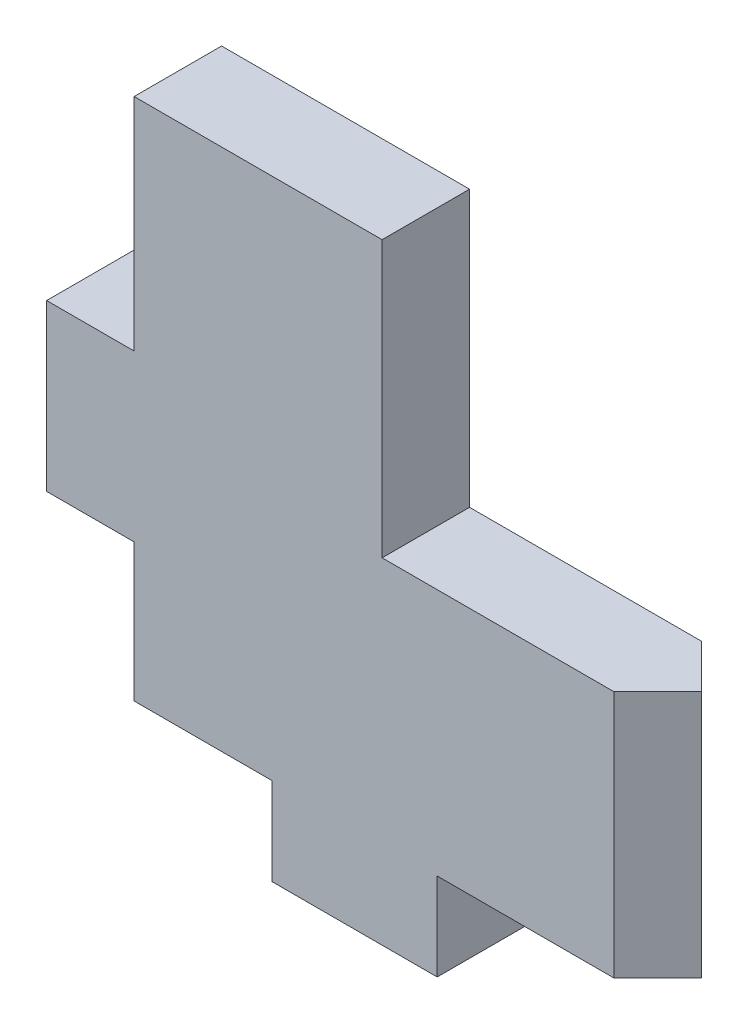
ISO-10303-21;
HEADER;
FILE_DESCRIPTION(('STEP AP214'),'2;1');
FILE_NAME('part.step','',(''),(''),'','','');
FILE_SCHEMA(('AUTOMOTIVE_DESIGN { 1 0 10303 214 1 1 1 1 }'));
ENDSEC;
DATA;
#1=APPLICATION_CONTEXT('core data for automotive mechanical design processes');
#2=APPLICATION_PROTOCOL_DEFINITION('international standard','automotive_design',2000,#1);
#3=PRODUCT_CONTEXT('',#1,'mechanical');
#4=PRODUCT('Part','Part','',(#3));
#5=PRODUCT_RELATED_PRODUCT_CATEGORY('part','',(#4));
#6=PRODUCT_DEFINITION_FORMATION('','',#4);
#7=PRODUCT_DEFINITION_CONTEXT('part definition',#1,'design');
#8=PRODUCT_DEFINITION('design','',#6,#7);
#9=PRODUCT_DEFINITION_SHAPE('','',#8);
#10=(LENGTH_UNIT() NAMED_UNIT(*) SI_UNIT(.MILLI.,.METRE.));
#11=(NAMED_UNIT(*) PLANE_ANGLE_UNIT() SI_UNIT($,.RADIAN.));
#12=(NAMED_UNIT(*) SI_UNIT($,.STERADIAN.) SOLID_ANGLE_UNIT());
#13=UNCERTAINTY_MEASURE_WITH_UNIT(LENGTH_MEASURE(1.E-05),#10,'distance_accuracy_value','');
#14=(GEOMETRIC_REPRESENTATION_CONTEXT(3) GLOBAL_UNCERTAINTY_ASSIGNED_CONTEXT((#13)) GLOBAL_UNIT_ASSIGNED_CONTEXT((#10,
#11,#12)) REPRESENTATION_CONTEXT('',''));
#15=CARTESIAN_POINT('',(0.,0.,0.));
#16=DIRECTION('',(0.,0.,1.));
#17=DIRECTION('',(1.,0.,0.));
#18=AXIS2_PLACEMENT_3D('',#15,#16,#17);
#19=CARTESIAN_POINT('',(11.,0.,1.5875));
#20=DIRECTION('',(0.,1.,0.));
#21=DIRECTION('',(0.,0.,1.));
#22=AXIS2_PLACEMENT_3D('',#19,#20,#21);
#23=PLANE('',#22);
#24=DIRECTION('',(-0.707106781186547,0.,-0.707106781186548));
#25=VECTOR('',#24,1.);
#26=CARTESIAN_POINT('',(15.79375,0.,-3.20625));
#27=LINE('',#26,#25);
#28=CARTESIAN_POINT('',(19.,0.,0.));
#29=VERTEX_POINT('',#28);
#30=CARTESIAN_POINT('',(17.4125,0.,-1.5875));
#31=VERTEX_POINT('',#30);
#32=EDGE_CURVE('E48',#29,#31,#27,.T.);
#33=ORIENTED_EDGE('',*,*,#32,.F.);
#34=DIRECTION('',(-0.707106781186541,0.,0.707106781186554));
#35=VECTOR('',#34,1.);
#36=CARTESIAN_POINT('',(14.2062500000001,0.,4.79375000000001));
#37=LINE('',#36,#35);
#38=CARTESIAN_POINT('',(17.4125,0.,1.5875));
#39=VERTEX_POINT('',#38);
#40=EDGE_CURVE('E171',#29,#39,#37,.T.);
#41=ORIENTED_EDGE('',*,*,#40,.T.);
#42=DIRECTION('',(1.,0.,0.));
#43=VECTOR('',#42,1.);
#44=CARTESIAN_POINT('',(11.,0.,1.5875));
#45=LINE('',#44,#43);
#46=CARTESIAN_POINT('',(11.,0.,1.5875));
#47=VERTEX_POINT('',#46);
#48=EDGE_CURVE('E260',#47,#39,#45,.T.);
#49=ORIENTED_EDGE('',*,*,#48,.F.);
#50=DIRECTION('',(0.,0.,-1.));
#51=VECTOR('',#50,1.);
#52=CARTESIAN_POINT('',(11.,0.,1.5875));
#53=LINE('',#52,#51);
#54=CARTESIAN_POINT('',(11.,0.,-1.5875));
#55=VERTEX_POINT('',#54);
#56=EDGE_CURVE('E207',#47,#55,#53,.T.);
#57=ORIENTED_EDGE('',*,*,#56,.T.);
#58=DIRECTION('',(1.,0.,0.));
#59=VECTOR('',#58,1.);
#60=CARTESIAN_POINT('',(11.,0.,-1.5875));
#61=LINE('',#60,#59);
#62=EDGE_CURVE('E179',#55,#31,#61,.T.);
#63=ORIENTED_EDGE('',*,*,#62,.T.);
#64=EDGE_LOOP('',(#33,#41,#49,#57,#63));
#65=FACE_BOUND('',#64,.T.);
#66=ADVANCED_FACE('F33',(#65),#23,.F.);
#67=CARTESIAN_POINT('',(19.,9.,1.5875));
#68=DIRECTION('',(0.,-1.,0.));
#69=DIRECTION('',(1.,0.,0.));
#70=AXIS2_PLACEMENT_3D('',#67,#68,#69);
#71=PLANE('',#70);
#72=DIRECTION('',(-1.,0.,0.));
#73=VECTOR('',#72,1.);
#74=CARTESIAN_POINT('',(19.,9.,1.5875));
#75=LINE('',#74,#73);
#76=CARTESIAN_POINT('',(17.4125,9.,1.5875));
#77=VERTEX_POINT('',#76);
#78=CARTESIAN_POINT('',(9.,9.,1.5875));
#79=VERTEX_POINT('',#78);
#80=EDGE_CURVE('E256',#77,#79,#75,.T.);
#81=ORIENTED_EDGE('',*,*,#80,.F.);
#82=DIRECTION('',(0.707106781186541,0.,-0.707106781186554));
#83=VECTOR('',#82,1.);
#84=CARTESIAN_POINT('',(18.20625,9.,0.793750000000014));
#85=LINE('',#84,#83);
#86=CARTESIAN_POINT('',(19.,9.,0.));
#87=VERTEX_POINT('',#86);
#88=EDGE_CURVE('E238',#77,#87,#85,.T.);
#89=ORIENTED_EDGE('',*,*,#88,.T.);
#90=DIRECTION('',(0.707106781186547,0.,0.707106781186548));
#91=VECTOR('',#90,1.);
#92=CARTESIAN_POINT('',(19.79375,9.,0.79375));
#93=LINE('',#92,#91);
#94=CARTESIAN_POINT('',(17.4125,9.,-1.5875));
#95=VERTEX_POINT('',#94);
#96=EDGE_CURVE('E225',#95,#87,#93,.T.);
#97=ORIENTED_EDGE('',*,*,#96,.F.);
#98=DIRECTION('',(-1.,0.,0.));
#99=VECTOR('',#98,1.);
#100=CARTESIAN_POINT('',(19.,9.,-1.5875));
#101=LINE('',#100,#99);
#102=CARTESIAN_POINT('',(9.,9.,-1.5875));
#103=VERTEX_POINT('',#102);
#104=EDGE_CURVE('E182',#95,#103,#101,.T.);
#105=ORIENTED_EDGE('',*,*,#104,.T.);
#106=DIRECTION('',(0.,0.,-1.));
#107=VECTOR('',#106,1.);
#108=CARTESIAN_POINT('',(9.,9.,1.5875));
#109=LINE('',#108,#107);
#110=EDGE_CURVE('E204',#79,#103,#109,.T.);
#111=ORIENTED_EDGE('',*,*,#110,.F.);
#112=EDGE_LOOP('',(#81,#89,#97,#105,#111));
#113=FACE_BOUND('',#112,.T.);
#114=ADVANCED_FACE('F235',(#113),#71,.F.);
#115=CARTESIAN_POINT('',(0.,0.,-1.5875));
#116=DIRECTION('',(0.,0.,1.));
#117=DIRECTION('',(1.,0.,0.));
#118=AXIS2_PLACEMENT_3D('',#115,#116,#117);
#119=PLANE('',#118);
#120=DIRECTION('',(0.,1.,0.));
#121=VECTOR('',#120,1.);
#122=CARTESIAN_POINT('',(17.4125,0.,-1.5875));
#123=LINE('',#122,#121);
#124=EDGE_CURVE('E41',#31,#95,#123,.T.);
#125=ORIENTED_EDGE('',*,*,#124,.F.);
#126=ORIENTED_EDGE('',*,*,#62,.F.);
#127=DIRECTION('',(0.,1.,0.));
#128=VECTOR('',#127,1.);
#129=CARTESIAN_POINT('',(11.,-3.175,-1.5875));
#130=LINE('',#129,#128);
#131=CARTESIAN_POINT('',(11.,-3.175,-1.5875));
#132=VERTEX_POINT('',#131);
#133=EDGE_CURVE('E177',#132,#55,#130,.T.);
#134=ORIENTED_EDGE('',*,*,#133,.F.);
#135=DIRECTION('',(1.,0.,0.));
#136=VECTOR('',#135,1.);
#137=CARTESIAN_POINT('',(5.,-3.175,-1.5875));
#138=LINE('',#137,#136);
#139=CARTESIAN_POINT('',(5.,-3.175,-1.5875));
#140=VERTEX_POINT('',#139);
#141=EDGE_CURVE('E175',#140,#132,#138,.T.);
#142=ORIENTED_EDGE('',*,*,#141,.F.);
#143=DIRECTION('',(0.,-1.,0.));
#144=VECTOR('',#143,1.);
#145=CARTESIAN_POINT('',(5.,0.,-1.5875));
#146=LINE('',#145,#144);
#147=CARTESIAN_POINT('',(5.,0.,-1.5875));
#148=VERTEX_POINT('',#147);
#149=EDGE_CURVE('E173',#148,#140,#146,.T.);
#150=ORIENTED_EDGE('',*,*,#149,.F.);
#151=DIRECTION('',(1.,0.,0.));
#152=VECTOR('',#151,1.);
#153=CARTESIAN_POINT('',(0.,0.,-1.5875));
#154=LINE('',#153,#152);
#155=CARTESIAN_POINT('',(0.,0.,-1.5875));
#156=VERTEX_POINT('',#155);
#157=EDGE_CURVE('E170',#156,#148,#154,.T.);
#158=ORIENTED_EDGE('',*,*,#157,.F.);
#159=DIRECTION('',(0.,-1.,0.));
#160=VECTOR('',#159,1.);
#161=CARTESIAN_POINT('',(0.,5.,-1.5875));
#162=LINE('',#161,#160);
#163=CARTESIAN_POINT('',(0.,5.,-1.5875));
#164=VERTEX_POINT('',#163);
#165=EDGE_CURVE('E167',#164,#156,#162,.T.);
#166=ORIENTED_EDGE('',*,*,#165,.F.);
#167=DIRECTION('',(1.,0.,0.));
#168=VECTOR('',#167,1.);
#169=CARTESIAN_POINT('',(-3.175,5.,-1.5875));
#170=LINE('',#169,#168);
#171=CARTESIAN_POINT('',(-3.175,5.,-1.5875));
#172=VERTEX_POINT('',#171);
#173=EDGE_CURVE('E102',#172,#164,#170,.T.);
#174=ORIENTED_EDGE('',*,*,#173,.F.);
#175=DIRECTION('',(0.,-1.,0.));
#176=VECTOR('',#175,1.);
#177=CARTESIAN_POINT('',(-3.175,11.,-1.5875));
#178=LINE('',#177,#176);
#179=CARTESIAN_POINT('',(-3.175,11.,-1.5875));
#180=VERTEX_POINT('',#179);
#181=EDGE_CURVE('E191',#180,#172,#178,.T.);
#182=ORIENTED_EDGE('',*,*,#181,.F.);
#183=DIRECTION('',(-1.,0.,0.));
#184=VECTOR('',#183,1.);
#185=CARTESIAN_POINT('',(0.,11.,-1.5875));
#186=LINE('',#185,#184);
#187=CARTESIAN_POINT('',(0.,11.,-1.5875));
#188=VERTEX_POINT('',#187);
#189=EDGE_CURVE('E155',#188,#180,#186,.T.);
#190=ORIENTED_EDGE('',*,*,#189,.F.);
#191=DIRECTION('',(0.,-1.,0.));
#192=VECTOR('',#191,1.);
#193=CARTESIAN_POINT('',(0.,19.,-1.5875));
#194=LINE('',#193,#192);
#195=CARTESIAN_POINT('',(0.,19.,-1.5875));
#196=VERTEX_POINT('',#195);
#197=EDGE_CURVE('E188',#196,#188,#194,.T.);
#198=ORIENTED_EDGE('',*,*,#197,.F.);
#199=DIRECTION('',(-1.,0.,0.));
#200=VECTOR('',#199,1.);
#201=CARTESIAN_POINT('',(8.99999999999999,19.,-1.5875));
#202=LINE('',#201,#200);
#203=CARTESIAN_POINT('',(8.99999999999999,19.,-1.5875));
#204=VERTEX_POINT('',#203);
#205=EDGE_CURVE('E186',#204,#196,#202,.T.);
#206=ORIENTED_EDGE('',*,*,#205,.F.);
#207=DIRECTION('',(0.,1.,0.));
#208=VECTOR('',#207,1.);
#209=CARTESIAN_POINT('',(9.,9.,-1.5875));
#210=LINE('',#209,#208);
#211=EDGE_CURVE('E184',#103,#204,#210,.T.);
#212=ORIENTED_EDGE('',*,*,#211,.F.);
#213=ORIENTED_EDGE('',*,*,#104,.F.);
#214=EDGE_LOOP('',(#125,#126,#134,#142,#150,#158,#166,#174,#182,#190,#198,#206,#212,#213));
#215=FACE_BOUND('',#214,.T.);
#216=ADVANCED_FACE('F242',(#215),#119,.F.);
#217=CARTESIAN_POINT('',(0.,5.,1.5875));
#218=DIRECTION('',(1.,0.,0.));
#219=DIRECTION('',(0.,1.,0.));
#220=AXIS2_PLACEMENT_3D('',#217,#218,#219);
#221=PLANE('',#220);
#222=ORIENTED_EDGE('',*,*,#165,.T.);
#223=DIRECTION('',(0.,0.,-1.));
#224=VECTOR('',#223,1.);
#225=CARTESIAN_POINT('',(0.,0.,1.5875));
#226=LINE('',#225,#224);
#227=CARTESIAN_POINT('',(0.,0.,1.5875));
#228=VERTEX_POINT('',#227);
#229=EDGE_CURVE('E219',#228,#156,#226,.T.);
#230=ORIENTED_EDGE('',*,*,#229,.F.);
#231=DIRECTION('',(0.,-1.,0.));
#232=VECTOR('',#231,1.);
#233=CARTESIAN_POINT('',(0.,5.,1.5875));
#234=LINE('',#233,#232);
#235=CARTESIAN_POINT('',(0.,5.,1.5875));
#236=VERTEX_POINT('',#235);
#237=EDGE_CURVE('E194',#236,#228,#234,.T.);
#238=ORIENTED_EDGE('',*,*,#237,.F.);
#239=DIRECTION('',(0.,0.,-1.));
#240=VECTOR('',#239,1.);
#241=CARTESIAN_POINT('',(0.,5.,1.5875));
#242=LINE('',#241,#240);
#243=EDGE_CURVE('E163',#236,#164,#242,.T.);
#244=ORIENTED_EDGE('',*,*,#243,.T.);
#245=EDGE_LOOP('',(#222,#230,#238,#244));
#246=FACE_BOUND('',#245,.T.);
#247=ADVANCED_FACE('F35',(#246),#221,.F.);
#248=CARTESIAN_POINT('',(0.,0.,1.5875));
#249=DIRECTION('',(0.,1.,0.));
#250=DIRECTION('',(0.,0.,1.));
#251=AXIS2_PLACEMENT_3D('',#248,#249,#250);
#252=PLANE('',#251);
#253=ORIENTED_EDGE('',*,*,#157,.T.);
#254=DIRECTION('',(0.,0.,-1.));
#255=VECTOR('',#254,1.);
#256=CARTESIAN_POINT('',(5.,0.,1.5875));
#257=LINE('',#256,#255);
#258=CARTESIAN_POINT('',(5.,0.,1.5875));
#259=VERTEX_POINT('',#258);
#260=EDGE_CURVE('E216',#259,#148,#257,.T.);
#261=ORIENTED_EDGE('',*,*,#260,.F.);
#262=DIRECTION('',(1.,0.,0.));
#263=VECTOR('',#262,1.);
#264=CARTESIAN_POINT('',(0.,0.,1.5875));
#265=LINE('',#264,#263);
#266=EDGE_CURVE('E111',#228,#259,#265,.T.);
#267=ORIENTED_EDGE('',*,*,#266,.F.);
#268=ORIENTED_EDGE('',*,*,#229,.T.);
#269=EDGE_LOOP('',(#253,#261,#267,#268));
#270=FACE_BOUND('',#269,.T.);
#271=ADVANCED_FACE('F300',(#270),#252,.F.);
#272=CARTESIAN_POINT('',(5.,0.,1.5875));
#273=DIRECTION('',(1.,0.,0.));
#274=DIRECTION('',(0.,0.,-1.));
#275=AXIS2_PLACEMENT_3D('',#272,#273,#274);
#276=PLANE('',#275);
#277=ORIENTED_EDGE('',*,*,#149,.T.);
#278=DIRECTION('',(0.,0.,-1.));
#279=VECTOR('',#278,1.);
#280=CARTESIAN_POINT('',(5.,-3.175,1.5875));
#281=LINE('',#280,#279);
#282=CARTESIAN_POINT('',(5.,-3.175,1.5875));
#283=VERTEX_POINT('',#282);
#284=EDGE_CURVE('E213',#283,#140,#281,.T.);
#285=ORIENTED_EDGE('',*,*,#284,.F.);
#286=DIRECTION('',(0.,-1.,0.));
#287=VECTOR('',#286,1.);
#288=CARTESIAN_POINT('',(5.,0.,1.5875));
#289=LINE('',#288,#287);
#290=EDGE_CURVE('E267',#259,#283,#289,.T.);
#291=ORIENTED_EDGE('',*,*,#290,.F.);
#292=ORIENTED_EDGE('',*,*,#260,.T.);
#293=EDGE_LOOP('',(#277,#285,#291,#292));
#294=FACE_BOUND('',#293,.T.);
#295=ADVANCED_FACE('F297',(#294),#276,.F.);
#296=CARTESIAN_POINT('',(5.,-3.175,1.5875));
#297=DIRECTION('',(0.,1.,0.));
#298=DIRECTION('',(-1.,0.,0.));
#299=AXIS2_PLACEMENT_3D('',#296,#297,#298);
#300=PLANE('',#299);
#301=ORIENTED_EDGE('',*,*,#141,.T.);
#302=DIRECTION('',(0.,0.,-1.));
#303=VECTOR('',#302,1.);
#304=CARTESIAN_POINT('',(11.,-3.175,1.5875));
#305=LINE('',#304,#303);
#306=CARTESIAN_POINT('',(11.,-3.175,1.5875));
#307=VERTEX_POINT('',#306);
#308=EDGE_CURVE('E210',#307,#132,#305,.T.);
#309=ORIENTED_EDGE('',*,*,#308,.F.);
#310=DIRECTION('',(1.,0.,0.));
#311=VECTOR('',#310,1.);
#312=CARTESIAN_POINT('',(5.,-3.175,1.5875));
#313=LINE('',#312,#311);
#314=EDGE_CURVE('E265',#283,#307,#313,.T.);
#315=ORIENTED_EDGE('',*,*,#314,.F.);
#316=ORIENTED_EDGE('',*,*,#284,.T.);
#317=EDGE_LOOP('',(#301,#309,#315,#316));
#318=FACE_BOUND('',#317,.T.);
#319=ADVANCED_FACE('F293',(#318),#300,.F.);
#320=CARTESIAN_POINT('',(11.,-3.175,1.5875));
#321=DIRECTION('',(-1.,0.,0.));
#322=DIRECTION('',(0.,0.,1.));
#323=AXIS2_PLACEMENT_3D('',#320,#321,#322);
#324=PLANE('',#323);
#325=ORIENTED_EDGE('',*,*,#133,.T.);
#326=ORIENTED_EDGE('',*,*,#56,.F.);
#327=DIRECTION('',(0.,1.,0.));
#328=VECTOR('',#327,1.);
#329=CARTESIAN_POINT('',(11.,-3.175,1.5875));
#330=LINE('',#329,#328);
#331=EDGE_CURVE('E263',#307,#47,#330,.T.);
#332=ORIENTED_EDGE('',*,*,#331,.F.);
#333=ORIENTED_EDGE('',*,*,#308,.T.);
#334=EDGE_LOOP('',(#325,#326,#332,#333));
#335=FACE_BOUND('',#334,.T.);
#336=ADVANCED_FACE('F288',(#335),#324,.F.);
#337=CARTESIAN_POINT('',(9.,9.,1.5875));
#338=DIRECTION('',(-1.,0.,0.));
#339=DIRECTION('',(0.,-1.,0.));
#340=AXIS2_PLACEMENT_3D('',#337,#338,#339);
#341=PLANE('',#340);
#342=ORIENTED_EDGE('',*,*,#211,.T.);
#343=DIRECTION('',(0.,0.,-1.));
#344=VECTOR('',#343,1.);
#345=CARTESIAN_POINT('',(8.99999999999999,19.,1.5875));
#346=LINE('',#345,#344);
#347=CARTESIAN_POINT('',(8.99999999999999,19.,1.5875));
#348=VERTEX_POINT('',#347);
#349=EDGE_CURVE('E201',#348,#204,#346,.T.);
#350=ORIENTED_EDGE('',*,*,#349,.F.);
#351=DIRECTION('',(0.,1.,0.));
#352=VECTOR('',#351,1.);
#353=CARTESIAN_POINT('',(9.,9.,1.5875));
#354=LINE('',#353,#352);
#355=EDGE_CURVE('E254',#79,#348,#354,.T.);
#356=ORIENTED_EDGE('',*,*,#355,.F.);
#357=ORIENTED_EDGE('',*,*,#110,.T.);
#358=EDGE_LOOP('',(#342,#350,#356,#357));
#359=FACE_BOUND('',#358,.T.);
#360=ADVANCED_FACE('F247',(#359),#341,.F.);
#361=CARTESIAN_POINT('',(8.99999999999999,19.,1.5875));
#362=DIRECTION('',(0.,-1.,0.));
#363=DIRECTION('',(0.,0.,-1.));
#364=AXIS2_PLACEMENT_3D('',#361,#362,#363);
#365=PLANE('',#364);
#366=ORIENTED_EDGE('',*,*,#205,.T.);
#367=DIRECTION('',(0.,0.,-1.));
#368=VECTOR('',#367,1.);
#369=CARTESIAN_POINT('',(0.,19.,1.5875));
#370=LINE('',#369,#368);
#371=CARTESIAN_POINT('',(0.,19.,1.5875));
#372=VERTEX_POINT('',#371);
#373=EDGE_CURVE('E198',#372,#196,#370,.T.);
#374=ORIENTED_EDGE('',*,*,#373,.F.);
#375=DIRECTION('',(-1.,0.,0.));
#376=VECTOR('',#375,1.);
#377=CARTESIAN_POINT('',(8.99999999999999,19.,1.5875));
#378=LINE('',#377,#376);
#379=EDGE_CURVE('E253',#348,#372,#378,.T.);
#380=ORIENTED_EDGE('',*,*,#379,.F.);
#381=ORIENTED_EDGE('',*,*,#349,.T.);
#382=EDGE_LOOP('',(#366,#374,#380,#381));
#383=FACE_BOUND('',#382,.T.);
#384=ADVANCED_FACE('F251',(#383),#365,.F.);
#385=CARTESIAN_POINT('',(0.,19.,1.5875));
#386=DIRECTION('',(1.,0.,0.));
#387=DIRECTION('',(0.,1.,0.));
#388=AXIS2_PLACEMENT_3D('',#385,#386,#387);
#389=PLANE('',#388);
#390=ORIENTED_EDGE('',*,*,#197,.T.);
#391=DIRECTION('',(0.,0.,-1.));
#392=VECTOR('',#391,1.);
#393=CARTESIAN_POINT('',(0.,11.,1.5875));
#394=LINE('',#393,#392);
#395=CARTESIAN_POINT('',(0.,11.,1.5875));
#396=VERTEX_POINT('',#395);
#397=EDGE_CURVE('E158',#396,#188,#394,.T.);
#398=ORIENTED_EDGE('',*,*,#397,.F.);
#399=DIRECTION('',(0.,-1.,0.));
#400=VECTOR('',#399,1.);
#401=CARTESIAN_POINT('',(0.,19.,1.5875));
#402=LINE('',#401,#400);
#403=EDGE_CURVE('E146',#372,#396,#402,.T.);
#404=ORIENTED_EDGE('',*,*,#403,.F.);
#405=ORIENTED_EDGE('',*,*,#373,.T.);
#406=EDGE_LOOP('',(#390,#398,#404,#405));
#407=FACE_BOUND('',#406,.T.);
#408=ADVANCED_FACE('F305',(#407),#389,.F.);
#409=CARTESIAN_POINT('',(0.,11.,1.5875));
#410=DIRECTION('',(0.,-1.,0.));
#411=DIRECTION('',(0.,0.,-1.));
#412=AXIS2_PLACEMENT_3D('',#409,#410,#411);
#413=PLANE('',#412);
#414=ORIENTED_EDGE('',*,*,#189,.T.);
#415=DIRECTION('',(0.,0.,-1.));
#416=VECTOR('',#415,1.);
#417=CARTESIAN_POINT('',(-3.175,11.,1.5875));
#418=LINE('',#417,#416);
#419=CARTESIAN_POINT('',(-3.175,11.,1.5875));
#420=VERTEX_POINT('',#419);
#421=EDGE_CURVE('E152',#420,#180,#418,.T.);
#422=ORIENTED_EDGE('',*,*,#421,.F.);
#423=DIRECTION('',(-1.,0.,0.));
#424=VECTOR('',#423,1.);
#425=CARTESIAN_POINT('',(0.,11.,1.5875));
#426=LINE('',#425,#424);
#427=EDGE_CURVE('E138',#396,#420,#426,.T.);
#428=ORIENTED_EDGE('',*,*,#427,.F.);
#429=ORIENTED_EDGE('',*,*,#397,.T.);
#430=EDGE_LOOP('',(#414,#422,#428,#429));
#431=FACE_BOUND('',#430,.T.);
#432=ADVANCED_FACE('F153',(#431),#413,.F.);
#433=CARTESIAN_POINT('',(-3.175,11.,1.5875));
#434=DIRECTION('',(1.,0.,0.));
#435=DIRECTION('',(0.,1.,0.));
#436=AXIS2_PLACEMENT_3D('',#433,#434,#435);
#437=PLANE('',#436);
#438=ORIENTED_EDGE('',*,*,#181,.T.);
#439=DIRECTION('',(0.,0.,-1.));
#440=VECTOR('',#439,1.);
#441=CARTESIAN_POINT('',(-3.175,5.,1.5875));
#442=LINE('',#441,#440);
#443=CARTESIAN_POINT('',(-3.175,5.,1.5875));
#444=VERTEX_POINT('',#443);
#445=EDGE_CURVE('E159',#444,#172,#442,.T.);
#446=ORIENTED_EDGE('',*,*,#445,.F.);
#447=DIRECTION('',(0.,-1.,0.));
#448=VECTOR('',#447,1.);
#449=CARTESIAN_POINT('',(-3.175,11.,1.5875));
#450=LINE('',#449,#448);
#451=EDGE_CURVE('E143',#420,#444,#450,.T.);
#452=ORIENTED_EDGE('',*,*,#451,.F.);
#453=ORIENTED_EDGE('',*,*,#421,.T.);
#454=EDGE_LOOP('',(#438,#446,#452,#453));
#455=FACE_BOUND('',#454,.T.);
#456=ADVANCED_FACE('F161',(#455),#437,.F.);
#457=CARTESIAN_POINT('',(-3.175,5.,1.5875));
#458=DIRECTION('',(0.,1.,0.));
#459=DIRECTION('',(0.,0.,1.));
#460=AXIS2_PLACEMENT_3D('',#457,#458,#459);
#461=PLANE('',#460);
#462=ORIENTED_EDGE('',*,*,#173,.T.);
#463=ORIENTED_EDGE('',*,*,#243,.F.);
#464=DIRECTION('',(1.,0.,0.));
#465=VECTOR('',#464,1.);
#466=CARTESIAN_POINT('',(-3.175,5.,1.5875));
#467=LINE('',#466,#465);
#468=EDGE_CURVE('E57',#444,#236,#467,.T.);
#469=ORIENTED_EDGE('',*,*,#468,.F.);
#470=ORIENTED_EDGE('',*,*,#445,.T.);
#471=EDGE_LOOP('',(#462,#463,#469,#470));
#472=FACE_BOUND('',#471,.T.);
#473=ADVANCED_FACE('F303',(#472),#461,.F.);
#474=CARTESIAN_POINT('',(0.,0.,1.5875));
#475=DIRECTION('',(0.,0.,1.));
#476=DIRECTION('',(1.,0.,0.));
#477=AXIS2_PLACEMENT_3D('',#474,#475,#476);
#478=PLANE('',#477);
#479=DIRECTION('',(0.,-1.,0.));
#480=VECTOR('',#479,1.);
#481=CARTESIAN_POINT('',(17.4125,0.,1.5875));
#482=LINE('',#481,#480);
#483=EDGE_CURVE('E11',#77,#39,#482,.T.);
#484=ORIENTED_EDGE('',*,*,#483,.F.);
#485=ORIENTED_EDGE('',*,*,#80,.T.);
#486=ORIENTED_EDGE('',*,*,#355,.T.);
#487=ORIENTED_EDGE('',*,*,#379,.T.);
#488=ORIENTED_EDGE('',*,*,#403,.T.);
#489=ORIENTED_EDGE('',*,*,#427,.T.);
#490=ORIENTED_EDGE('',*,*,#451,.T.);
#491=ORIENTED_EDGE('',*,*,#468,.T.);
#492=ORIENTED_EDGE('',*,*,#237,.T.);
#493=ORIENTED_EDGE('',*,*,#266,.T.);
#494=ORIENTED_EDGE('',*,*,#290,.T.);
#495=ORIENTED_EDGE('',*,*,#314,.T.);
#496=ORIENTED_EDGE('',*,*,#331,.T.);
#497=ORIENTED_EDGE('',*,*,#48,.T.);
#498=EDGE_LOOP('',(#484,#485,#486,#487,#488,#489,#490,#491,#492,#493,#494,#495,#496,#497));
#499=FACE_BOUND('',#498,.T.);
#500=ADVANCED_FACE('F141',(#499),#478,.T.);
#501=CARTESIAN_POINT('',(9.50000000000017,-1.,9.5));
#502=DIRECTION('',(-0.707106781186554,0.,-0.707106781186541));
#503=DIRECTION('',(-0.707106781186541,0.,0.707106781186554));
#504=AXIS2_PLACEMENT_3D('',#501,#502,#503);
#505=PLANE('',#504);
#506=DIRECTION('',(0.,1.,0.));
#507=VECTOR('',#506,1.);
#508=CARTESIAN_POINT('',(19.,-0.999999999999997,0.));
#509=LINE('',#508,#507);
#510=EDGE_CURVE('E239',#29,#87,#509,.T.);
#511=ORIENTED_EDGE('',*,*,#510,.T.);
#512=ORIENTED_EDGE('',*,*,#88,.F.);
#513=ORIENTED_EDGE('',*,*,#483,.T.);
#514=ORIENTED_EDGE('',*,*,#40,.F.);
#515=EDGE_LOOP('',(#511,#512,#513,#514));
#516=FACE_BOUND('',#515,.T.);
#517=ADVANCED_FACE('F277',(#516),#505,.F.);
#518=CARTESIAN_POINT('',(9.50000000000001,-1.,-9.5));
#519=DIRECTION('',(0.707106781186548,0.,-0.707106781186547));
#520=DIRECTION('',(-0.707106781186547,0.,-0.707106781186548));
#521=AXIS2_PLACEMENT_3D('',#518,#519,#520);
#522=PLANE('',#521);
#523=ORIENTED_EDGE('',*,*,#32,.T.);
#524=ORIENTED_EDGE('',*,*,#124,.T.);
#525=ORIENTED_EDGE('',*,*,#96,.T.);
#526=ORIENTED_EDGE('',*,*,#510,.F.);
#527=EDGE_LOOP('',(#523,#524,#525,#526));
#528=FACE_BOUND('',#527,.T.);
#529=ADVANCED_FACE('F223',(#528),#522,.T.);
#530=CLOSED_SHELL('',(#66,#114,#216,#247,#271,#295,#319,#336,#360,#384,#408,#432,#456,#473,#500,
#517,#529));
#531=MANIFOLD_SOLID_BREP('B2',#530);
#532=ADVANCED_BREP_SHAPE_REPRESENTATION('',(#18,#531),#14);
#533=SHAPE_DEFINITION_REPRESENTATION(#9,#532);
ENDSEC;
END-ISO-10303-21;
